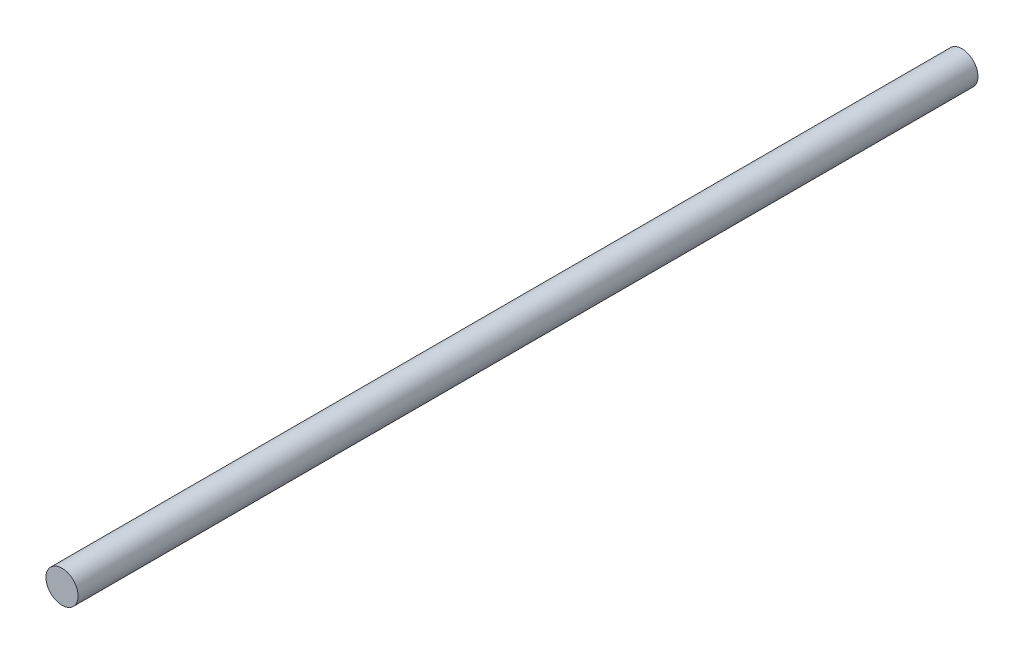
ISO-10303-21;
HEADER;
FILE_DESCRIPTION(('STEP AP214'),'2;1');
FILE_NAME('part.step','',(''),(''),'','','');
FILE_SCHEMA(('AUTOMOTIVE_DESIGN { 1 0 10303 214 1 1 1 1 }'));
ENDSEC;
DATA;
#1=APPLICATION_CONTEXT('core data for automotive mechanical design processes');
#2=APPLICATION_PROTOCOL_DEFINITION('international standard','automotive_design',2000,#1);
#3=PRODUCT_CONTEXT('',#1,'mechanical');
#4=PRODUCT('Part','Part','',(#3));
#5=PRODUCT_RELATED_PRODUCT_CATEGORY('part','',(#4));
#6=PRODUCT_DEFINITION_FORMATION('','',#4);
#7=PRODUCT_DEFINITION_CONTEXT('part definition',#1,'design');
#8=PRODUCT_DEFINITION('design','',#6,#7);
#9=PRODUCT_DEFINITION_SHAPE('','',#8);
#10=(LENGTH_UNIT() NAMED_UNIT(*) SI_UNIT(.MILLI.,.METRE.));
#11=(NAMED_UNIT(*) PLANE_ANGLE_UNIT() SI_UNIT($,.RADIAN.));
#12=(NAMED_UNIT(*) SI_UNIT($,.STERADIAN.) SOLID_ANGLE_UNIT());
#13=UNCERTAINTY_MEASURE_WITH_UNIT(LENGTH_MEASURE(1.E-05),#10,'distance_accuracy_value','');
#14=(GEOMETRIC_REPRESENTATION_CONTEXT(3) GLOBAL_UNCERTAINTY_ASSIGNED_CONTEXT((#13)) GLOBAL_UNIT_ASSIGNED_CONTEXT((#10,
#11,#12)) REPRESENTATION_CONTEXT('',''));
#15=CARTESIAN_POINT('',(0.,0.,0.));
#16=DIRECTION('',(0.,0.,1.));
#17=DIRECTION('',(1.,0.,0.));
#18=AXIS2_PLACEMENT_3D('',#15,#16,#17);
#19=CARTESIAN_POINT('',(0.,0.,140.));
#20=DIRECTION('',(0.,0.,-1.));
#21=DIRECTION('',(-1.,0.,0.));
#22=AXIS2_PLACEMENT_3D('',#19,#20,#21);
#23=CYLINDRICAL_SURFACE('',#22,2.5);
#24=CARTESIAN_POINT('',(0.,0.,140.));
#25=DIRECTION('',(0.,0.,1.));
#26=DIRECTION('',(1.,0.,0.));
#27=AXIS2_PLACEMENT_3D('',#24,#25,#26);
#28=CIRCLE('',#27,2.5);
#29=CARTESIAN_POINT('',(2.5,0.,140.));
#30=VERTEX_POINT('',#29);
#31=EDGE_CURVE('E10',#30,#30,#28,.T.);
#32=ORIENTED_EDGE('',*,*,#31,.F.);
#33=EDGE_LOOP('',(#32));
#34=FACE_BOUND('',#33,.T.);
#35=CARTESIAN_POINT('',(0.,0.,0.));
#36=DIRECTION('',(0.,0.,1.));
#37=DIRECTION('',(1.,0.,0.));
#38=AXIS2_PLACEMENT_3D('',#35,#36,#37);
#39=CIRCLE('',#38,2.5);
#40=CARTESIAN_POINT('',(2.5,0.,0.));
#41=VERTEX_POINT('',#40);
#42=EDGE_CURVE('E40',#41,#41,#39,.T.);
#43=ORIENTED_EDGE('',*,*,#42,.T.);
#44=EDGE_LOOP('',(#43));
#45=FACE_BOUND('',#44,.T.);
#46=ADVANCED_FACE('F37',(#34,#45),#23,.T.);
#47=CARTESIAN_POINT('',(0.,0.,140.));
#48=DIRECTION('',(0.,0.,1.));
#49=DIRECTION('',(1.,0.,0.));
#50=AXIS2_PLACEMENT_3D('',#47,#48,#49);
#51=PLANE('',#50);
#52=ORIENTED_EDGE('',*,*,#31,.T.);
#53=EDGE_LOOP('',(#52));
#54=FACE_BOUND('',#53,.T.);
#55=ADVANCED_FACE('F54',(#54),#51,.T.);
#56=CARTESIAN_POINT('',(0.,0.,0.));
#57=DIRECTION('',(0.,0.,1.));
#58=DIRECTION('',(1.,0.,0.));
#59=AXIS2_PLACEMENT_3D('',#56,#57,#58);
#60=PLANE('',#59);
#61=ORIENTED_EDGE('',*,*,#42,.F.);
#62=EDGE_LOOP('',(#61));
#63=FACE_BOUND('',#62,.T.);
#64=ADVANCED_FACE('F52',(#63),#60,.F.);
#65=CLOSED_SHELL('',(#46,#55,#64));
#66=MANIFOLD_SOLID_BREP('B2',#65);
#67=ADVANCED_BREP_SHAPE_REPRESENTATION('',(#18,#66),#14);
#68=SHAPE_DEFINITION_REPRESENTATION(#9,#67);
ENDSEC;
END-ISO-10303-21;
